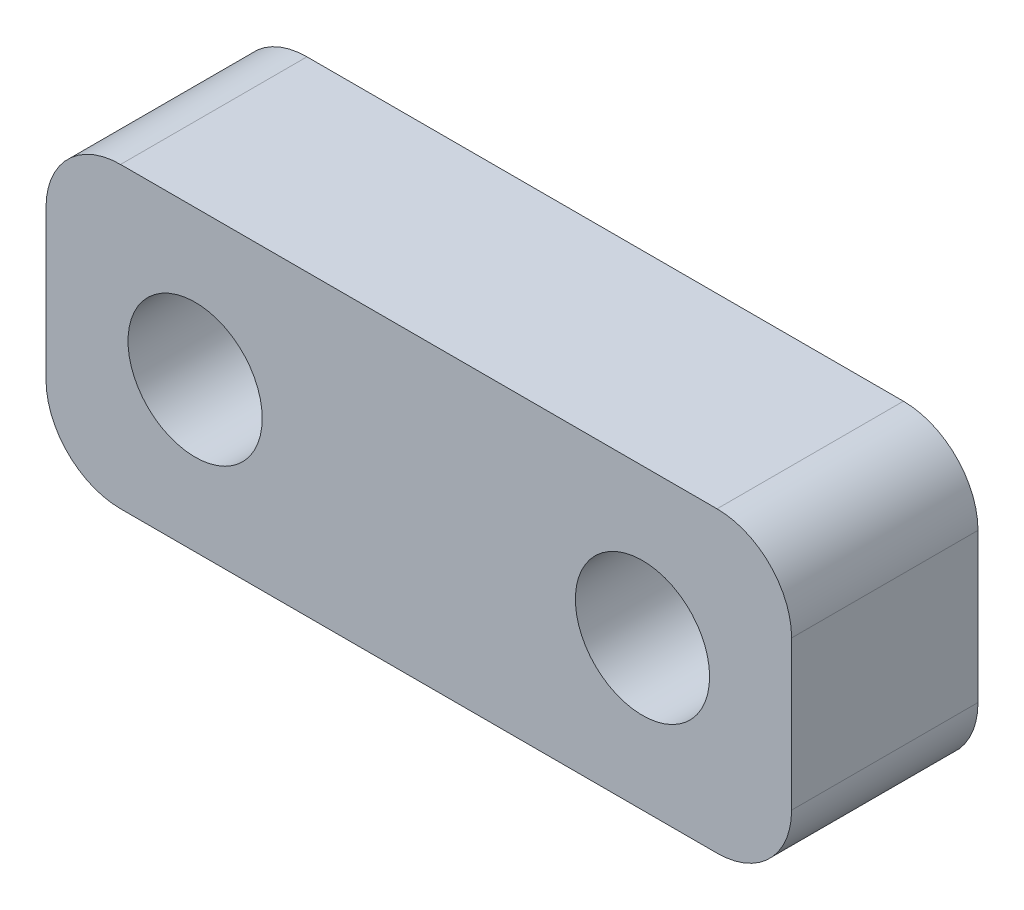
ISO-10303-21;
HEADER;
FILE_DESCRIPTION(('STEP AP214'),'2;1');
FILE_NAME('part.step','',(''),(''),'','','');
FILE_SCHEMA(('AUTOMOTIVE_DESIGN { 1 0 10303 214 1 1 1 1 }'));
ENDSEC;
DATA;
#1=APPLICATION_CONTEXT('core data for automotive mechanical design processes');
#2=APPLICATION_PROTOCOL_DEFINITION('international standard','automotive_design',2000,#1);
#3=PRODUCT_CONTEXT('',#1,'mechanical');
#4=PRODUCT('Part','Part','',(#3));
#5=PRODUCT_RELATED_PRODUCT_CATEGORY('part','',(#4));
#6=PRODUCT_DEFINITION_FORMATION('','',#4);
#7=PRODUCT_DEFINITION_CONTEXT('part definition',#1,'design');
#8=PRODUCT_DEFINITION('design','',#6,#7);
#9=PRODUCT_DEFINITION_SHAPE('','',#8);
#10=(LENGTH_UNIT() NAMED_UNIT(*) SI_UNIT(.MILLI.,.METRE.));
#11=(NAMED_UNIT(*) PLANE_ANGLE_UNIT() SI_UNIT($,.RADIAN.));
#12=(NAMED_UNIT(*) SI_UNIT($,.STERADIAN.) SOLID_ANGLE_UNIT());
#13=UNCERTAINTY_MEASURE_WITH_UNIT(LENGTH_MEASURE(1.E-05),#10,'distance_accuracy_value','');
#14=(GEOMETRIC_REPRESENTATION_CONTEXT(3) GLOBAL_UNCERTAINTY_ASSIGNED_CONTEXT((#13)) GLOBAL_UNIT_ASSIGNED_CONTEXT((#10,
#11,#12)) REPRESENTATION_CONTEXT('',''));
#15=CARTESIAN_POINT('',(0.,0.,0.));
#16=DIRECTION('',(0.,0.,1.));
#17=DIRECTION('',(1.,0.,0.));
#18=AXIS2_PLACEMENT_3D('',#15,#16,#17);
#19=CARTESIAN_POINT('',(0.,0.,5.));
#20=DIRECTION('',(1.,0.,0.));
#21=DIRECTION('',(0.,1.,0.));
#22=AXIS2_PLACEMENT_3D('',#19,#20,#21);
#23=PLANE('',#22);
#24=DIRECTION('',(0.,-1.,0.));
#25=VECTOR('',#24,1.);
#26=CARTESIAN_POINT('',(0.,0.,0.));
#27=LINE('',#26,#25);
#28=CARTESIAN_POINT('',(0.,6.,0.));
#29=VERTEX_POINT('',#28);
#30=CARTESIAN_POINT('',(0.,2.,0.));
#31=VERTEX_POINT('',#30);
#32=EDGE_CURVE('E126',#29,#31,#27,.T.);
#33=ORIENTED_EDGE('',*,*,#32,.T.);
#34=DIRECTION('',(0.,0.,-1.));
#35=VECTOR('',#34,1.);
#36=CARTESIAN_POINT('',(0.,2.,5.));
#37=LINE('',#36,#35);
#38=CARTESIAN_POINT('',(0.,2.,5.));
#39=VERTEX_POINT('',#38);
#40=EDGE_CURVE('E104',#31,#39,#37,.F.);
#41=ORIENTED_EDGE('',*,*,#40,.T.);
#42=DIRECTION('',(0.,-1.,0.));
#43=VECTOR('',#42,1.);
#44=CARTESIAN_POINT('',(0.,0.,5.));
#45=LINE('',#44,#43);
#46=CARTESIAN_POINT('',(0.,6.,5.));
#47=VERTEX_POINT('',#46);
#48=EDGE_CURVE('E136',#47,#39,#45,.T.);
#49=ORIENTED_EDGE('',*,*,#48,.F.);
#50=DIRECTION('',(0.,0.,-1.));
#51=VECTOR('',#50,1.);
#52=CARTESIAN_POINT('',(0.,6.,5.));
#53=LINE('',#52,#51);
#54=EDGE_CURVE('E109',#47,#29,#53,.T.);
#55=ORIENTED_EDGE('',*,*,#54,.T.);
#56=EDGE_LOOP('',(#33,#41,#49,#55));
#57=FACE_BOUND('',#56,.T.);
#58=ADVANCED_FACE('F33',(#57),#23,.F.);
#59=CARTESIAN_POINT('',(0.,0.,5.));
#60=DIRECTION('',(0.,1.,0.));
#61=DIRECTION('',(0.,0.,1.));
#62=AXIS2_PLACEMENT_3D('',#59,#60,#61);
#63=PLANE('',#62);
#64=DIRECTION('',(1.,0.,0.));
#65=VECTOR('',#64,1.);
#66=CARTESIAN_POINT('',(0.,0.,5.));
#67=LINE('',#66,#65);
#68=CARTESIAN_POINT('',(2.,0.,5.));
#69=VERTEX_POINT('',#68);
#70=CARTESIAN_POINT('',(18.,0.,5.));
#71=VERTEX_POINT('',#70);
#72=EDGE_CURVE('E119',#69,#71,#67,.T.);
#73=ORIENTED_EDGE('',*,*,#72,.F.);
#74=DIRECTION('',(0.,0.,-1.));
#75=VECTOR('',#74,1.);
#76=CARTESIAN_POINT('',(2.,0.,5.));
#77=LINE('',#76,#75);
#78=CARTESIAN_POINT('',(2.,0.,0.));
#79=VERTEX_POINT('',#78);
#80=EDGE_CURVE('E103',#69,#79,#77,.T.);
#81=ORIENTED_EDGE('',*,*,#80,.T.);
#82=DIRECTION('',(1.,0.,0.));
#83=VECTOR('',#82,1.);
#84=CARTESIAN_POINT('',(0.,0.,0.));
#85=LINE('',#84,#83);
#86=CARTESIAN_POINT('',(18.,0.,0.));
#87=VERTEX_POINT('',#86);
#88=EDGE_CURVE('E116',#79,#87,#85,.T.);
#89=ORIENTED_EDGE('',*,*,#88,.T.);
#90=DIRECTION('',(0.,0.,-1.));
#91=VECTOR('',#90,1.);
#92=CARTESIAN_POINT('',(18.,0.,5.));
#93=LINE('',#92,#91);
#94=EDGE_CURVE('E121',#87,#71,#93,.F.);
#95=ORIENTED_EDGE('',*,*,#94,.T.);
#96=EDGE_LOOP('',(#73,#81,#89,#95));
#97=FACE_BOUND('',#96,.T.);
#98=ADVANCED_FACE('F115',(#97),#63,.F.);
#99=CARTESIAN_POINT('',(20.,0.,5.));
#100=DIRECTION('',(-1.,0.,0.));
#101=DIRECTION('',(0.,-1.,0.));
#102=AXIS2_PLACEMENT_3D('',#99,#100,#101);
#103=PLANE('',#102);
#104=DIRECTION('',(0.,1.,0.));
#105=VECTOR('',#104,1.);
#106=CARTESIAN_POINT('',(20.,0.,5.));
#107=LINE('',#106,#105);
#108=CARTESIAN_POINT('',(20.,2.,5.));
#109=VERTEX_POINT('',#108);
#110=CARTESIAN_POINT('',(20.,6.,5.));
#111=VERTEX_POINT('',#110);
#112=EDGE_CURVE('E162',#109,#111,#107,.T.);
#113=ORIENTED_EDGE('',*,*,#112,.F.);
#114=DIRECTION('',(0.,0.,-1.));
#115=VECTOR('',#114,1.);
#116=CARTESIAN_POINT('',(20.,2.,5.));
#117=LINE('',#116,#115);
#118=CARTESIAN_POINT('',(20.,2.,0.));
#119=VERTEX_POINT('',#118);
#120=EDGE_CURVE('E155',#109,#119,#117,.T.);
#121=ORIENTED_EDGE('',*,*,#120,.T.);
#122=DIRECTION('',(0.,1.,0.));
#123=VECTOR('',#122,1.);
#124=CARTESIAN_POINT('',(20.,0.,0.));
#125=LINE('',#124,#123);
#126=CARTESIAN_POINT('',(20.,6.,0.));
#127=VERTEX_POINT('',#126);
#128=EDGE_CURVE('E125',#119,#127,#125,.T.);
#129=ORIENTED_EDGE('',*,*,#128,.T.);
#130=DIRECTION('',(0.,0.,-1.));
#131=VECTOR('',#130,1.);
#132=CARTESIAN_POINT('',(20.,6.,5.));
#133=LINE('',#132,#131);
#134=EDGE_CURVE('E153',#127,#111,#133,.F.);
#135=ORIENTED_EDGE('',*,*,#134,.T.);
#136=EDGE_LOOP('',(#113,#121,#129,#135));
#137=FACE_BOUND('',#136,.T.);
#138=ADVANCED_FACE('F160',(#137),#103,.F.);
#139=CARTESIAN_POINT('',(0.,8.,5.));
#140=DIRECTION('',(0.,-1.,0.));
#141=DIRECTION('',(0.,0.,-1.));
#142=AXIS2_PLACEMENT_3D('',#139,#140,#141);
#143=PLANE('',#142);
#144=DIRECTION('',(-1.,0.,0.));
#145=VECTOR('',#144,1.);
#146=CARTESIAN_POINT('',(0.,8.,5.));
#147=LINE('',#146,#145);
#148=CARTESIAN_POINT('',(18.,8.,5.));
#149=VERTEX_POINT('',#148);
#150=CARTESIAN_POINT('',(2.,8.,5.));
#151=VERTEX_POINT('',#150);
#152=EDGE_CURVE('E137',#149,#151,#147,.T.);
#153=ORIENTED_EDGE('',*,*,#152,.F.);
#154=DIRECTION('',(0.,0.,-1.));
#155=VECTOR('',#154,1.);
#156=CARTESIAN_POINT('',(18.,8.,5.));
#157=LINE('',#156,#155);
#158=CARTESIAN_POINT('',(18.,8.,0.));
#159=VERTEX_POINT('',#158);
#160=EDGE_CURVE('E11',#149,#159,#157,.T.);
#161=ORIENTED_EDGE('',*,*,#160,.T.);
#162=DIRECTION('',(-1.,0.,0.));
#163=VECTOR('',#162,1.);
#164=CARTESIAN_POINT('',(0.,8.,0.));
#165=LINE('',#164,#163);
#166=CARTESIAN_POINT('',(2.,8.,0.));
#167=VERTEX_POINT('',#166);
#168=EDGE_CURVE('E129',#159,#167,#165,.T.);
#169=ORIENTED_EDGE('',*,*,#168,.T.);
#170=DIRECTION('',(0.,0.,-1.));
#171=VECTOR('',#170,1.);
#172=CARTESIAN_POINT('',(2.,8.,5.));
#173=LINE('',#172,#171);
#174=EDGE_CURVE('E41',#167,#151,#173,.F.);
#175=ORIENTED_EDGE('',*,*,#174,.T.);
#176=EDGE_LOOP('',(#153,#161,#169,#175));
#177=FACE_BOUND('',#176,.T.);
#178=ADVANCED_FACE('F169',(#177),#143,.F.);
#179=CARTESIAN_POINT('',(0.,0.,5.));
#180=DIRECTION('',(0.,0.,-1.));
#181=DIRECTION('',(-1.,0.,0.));
#182=AXIS2_PLACEMENT_3D('',#179,#180,#181);
#183=PLANE('',#182);
#184=CARTESIAN_POINT('',(4.,4.,5.));
#185=DIRECTION('',(0.,0.,1.));
#186=DIRECTION('',(1.,0.,0.));
#187=AXIS2_PLACEMENT_3D('',#184,#185,#186);
#188=CIRCLE('',#187,1.8);
#189=CARTESIAN_POINT('',(5.8,4.,5.));
#190=VERTEX_POINT('',#189);
#191=EDGE_CURVE('E184',#190,#190,#188,.T.);
#192=ORIENTED_EDGE('',*,*,#191,.F.);
#193=EDGE_LOOP('',(#192));
#194=FACE_BOUND('',#193,.T.);
#195=CARTESIAN_POINT('',(16.,4.,5.));
#196=DIRECTION('',(0.,0.,1.));
#197=DIRECTION('',(1.,0.,0.));
#198=AXIS2_PLACEMENT_3D('',#195,#196,#197);
#199=CIRCLE('',#198,1.8);
#200=CARTESIAN_POINT('',(17.8,4.,5.));
#201=VERTEX_POINT('',#200);
#202=EDGE_CURVE('E178',#201,#201,#199,.T.);
#203=ORIENTED_EDGE('',*,*,#202,.F.);
#204=EDGE_LOOP('',(#203));
#205=FACE_BOUND('',#204,.T.);
#206=ORIENTED_EDGE('',*,*,#48,.T.);
#207=CARTESIAN_POINT('',(2.,2.,5.));
#208=DIRECTION('',(0.,0.,-1.));
#209=DIRECTION('',(-1.,0.,0.));
#210=AXIS2_PLACEMENT_3D('',#207,#208,#209);
#211=CIRCLE('',#210,2.);
#212=EDGE_CURVE('E151',#39,#69,#211,.F.);
#213=ORIENTED_EDGE('',*,*,#212,.T.);
#214=ORIENTED_EDGE('',*,*,#72,.T.);
#215=CARTESIAN_POINT('',(18.,2.,5.));
#216=DIRECTION('',(0.,0.,-1.));
#217=DIRECTION('',(-1.,0.,0.));
#218=AXIS2_PLACEMENT_3D('',#215,#216,#217);
#219=CIRCLE('',#218,2.);
#220=EDGE_CURVE('E149',#71,#109,#219,.F.);
#221=ORIENTED_EDGE('',*,*,#220,.T.);
#222=ORIENTED_EDGE('',*,*,#112,.T.);
#223=CARTESIAN_POINT('',(18.,6.,5.));
#224=DIRECTION('',(0.,0.,-1.));
#225=DIRECTION('',(-1.,0.,0.));
#226=AXIS2_PLACEMENT_3D('',#223,#224,#225);
#227=CIRCLE('',#226,2.);
#228=EDGE_CURVE('E54',#111,#149,#227,.F.);
#229=ORIENTED_EDGE('',*,*,#228,.T.);
#230=ORIENTED_EDGE('',*,*,#152,.T.);
#231=CARTESIAN_POINT('',(2.,6.,5.));
#232=DIRECTION('',(0.,0.,-1.));
#233=DIRECTION('',(-1.,0.,0.));
#234=AXIS2_PLACEMENT_3D('',#231,#232,#233);
#235=CIRCLE('',#234,2.);
#236=EDGE_CURVE('E146',#151,#47,#235,.F.);
#237=ORIENTED_EDGE('',*,*,#236,.T.);
#238=EDGE_LOOP('',(#206,#213,#214,#221,#222,#229,#230,#237));
#239=FACE_BOUND('',#238,.T.);
#240=ADVANCED_FACE('F190',(#194,#205,#239),#183,.F.);
#241=CARTESIAN_POINT('',(0.,0.,0.));
#242=DIRECTION('',(0.,0.,-1.));
#243=DIRECTION('',(-1.,0.,0.));
#244=AXIS2_PLACEMENT_3D('',#241,#242,#243);
#245=PLANE('',#244);
#246=CARTESIAN_POINT('',(4.,4.,0.));
#247=DIRECTION('',(0.,0.,1.));
#248=DIRECTION('',(1.,0.,0.));
#249=AXIS2_PLACEMENT_3D('',#246,#247,#248);
#250=CIRCLE('',#249,1.8);
#251=CARTESIAN_POINT('',(5.8,4.,0.));
#252=VERTEX_POINT('',#251);
#253=EDGE_CURVE('E181',#252,#252,#250,.T.);
#254=ORIENTED_EDGE('',*,*,#253,.T.);
#255=EDGE_LOOP('',(#254));
#256=FACE_BOUND('',#255,.T.);
#257=CARTESIAN_POINT('',(16.,4.,0.));
#258=DIRECTION('',(0.,0.,1.));
#259=DIRECTION('',(1.,0.,0.));
#260=AXIS2_PLACEMENT_3D('',#257,#258,#259);
#261=CIRCLE('',#260,1.8);
#262=CARTESIAN_POINT('',(17.8,4.,0.));
#263=VERTEX_POINT('',#262);
#264=EDGE_CURVE('E131',#263,#263,#261,.T.);
#265=ORIENTED_EDGE('',*,*,#264,.T.);
#266=EDGE_LOOP('',(#265));
#267=FACE_BOUND('',#266,.T.);
#268=ORIENTED_EDGE('',*,*,#88,.F.);
#269=CARTESIAN_POINT('',(2.,2.,0.));
#270=DIRECTION('',(0.,0.,-1.));
#271=DIRECTION('',(-1.,0.,0.));
#272=AXIS2_PLACEMENT_3D('',#269,#270,#271);
#273=CIRCLE('',#272,2.);
#274=EDGE_CURVE('E99',#79,#31,#273,.T.);
#275=ORIENTED_EDGE('',*,*,#274,.T.);
#276=ORIENTED_EDGE('',*,*,#32,.F.);
#277=CARTESIAN_POINT('',(2.,6.,0.));
#278=DIRECTION('',(0.,0.,-1.));
#279=DIRECTION('',(-1.,0.,0.));
#280=AXIS2_PLACEMENT_3D('',#277,#278,#279);
#281=CIRCLE('',#280,2.);
#282=EDGE_CURVE('E120',#29,#167,#281,.T.);
#283=ORIENTED_EDGE('',*,*,#282,.T.);
#284=ORIENTED_EDGE('',*,*,#168,.F.);
#285=CARTESIAN_POINT('',(18.,6.,0.));
#286=DIRECTION('',(0.,0.,-1.));
#287=DIRECTION('',(-1.,0.,0.));
#288=AXIS2_PLACEMENT_3D('',#285,#286,#287);
#289=CIRCLE('',#288,2.);
#290=EDGE_CURVE('E140',#159,#127,#289,.T.);
#291=ORIENTED_EDGE('',*,*,#290,.T.);
#292=ORIENTED_EDGE('',*,*,#128,.F.);
#293=CARTESIAN_POINT('',(18.,2.,0.));
#294=DIRECTION('',(0.,0.,-1.));
#295=DIRECTION('',(-1.,0.,0.));
#296=AXIS2_PLACEMENT_3D('',#293,#294,#295);
#297=CIRCLE('',#296,2.);
#298=EDGE_CURVE('E110',#119,#87,#297,.T.);
#299=ORIENTED_EDGE('',*,*,#298,.T.);
#300=EDGE_LOOP('',(#268,#275,#276,#283,#284,#291,#292,#299));
#301=FACE_BOUND('',#300,.T.);
#302=ADVANCED_FACE('F123',(#256,#267,#301),#245,.T.);
#303=CARTESIAN_POINT('',(16.,4.,5.));
#304=DIRECTION('',(0.,0.,1.));
#305=DIRECTION('',(1.,0.,0.));
#306=AXIS2_PLACEMENT_3D('',#303,#304,#305);
#307=CYLINDRICAL_SURFACE('',#306,1.8);
#308=ORIENTED_EDGE('',*,*,#264,.F.);
#309=EDGE_LOOP('',(#308));
#310=FACE_BOUND('',#309,.T.);
#311=ORIENTED_EDGE('',*,*,#202,.T.);
#312=EDGE_LOOP('',(#311));
#313=FACE_BOUND('',#312,.T.);
#314=ADVANCED_FACE('F244',(#310,#313),#307,.F.);
#315=CARTESIAN_POINT('',(4.,4.,5.));
#316=DIRECTION('',(0.,0.,1.));
#317=DIRECTION('',(1.,0.,0.));
#318=AXIS2_PLACEMENT_3D('',#315,#316,#317);
#319=CYLINDRICAL_SURFACE('',#318,1.8);
#320=ORIENTED_EDGE('',*,*,#253,.F.);
#321=EDGE_LOOP('',(#320));
#322=FACE_BOUND('',#321,.T.);
#323=ORIENTED_EDGE('',*,*,#191,.T.);
#324=EDGE_LOOP('',(#323));
#325=FACE_BOUND('',#324,.T.);
#326=ADVANCED_FACE('F188',(#322,#325),#319,.F.);
#327=CARTESIAN_POINT('',(2.,2.,5.));
#328=DIRECTION('',(0.,0.,-1.));
#329=DIRECTION('',(-1.,0.,0.));
#330=AXIS2_PLACEMENT_3D('',#327,#328,#329);
#331=CYLINDRICAL_SURFACE('',#330,2.);
#332=ORIENTED_EDGE('',*,*,#212,.F.);
#333=ORIENTED_EDGE('',*,*,#40,.F.);
#334=ORIENTED_EDGE('',*,*,#274,.F.);
#335=ORIENTED_EDGE('',*,*,#80,.F.);
#336=EDGE_LOOP('',(#332,#333,#334,#335));
#337=FACE_BOUND('',#336,.T.);
#338=ADVANCED_FACE('F102',(#337),#331,.T.);
#339=CARTESIAN_POINT('',(18.,2.,5.));
#340=DIRECTION('',(0.,0.,-1.));
#341=DIRECTION('',(-1.,0.,0.));
#342=AXIS2_PLACEMENT_3D('',#339,#340,#341);
#343=CYLINDRICAL_SURFACE('',#342,2.);
#344=ORIENTED_EDGE('',*,*,#220,.F.);
#345=ORIENTED_EDGE('',*,*,#94,.F.);
#346=ORIENTED_EDGE('',*,*,#298,.F.);
#347=ORIENTED_EDGE('',*,*,#120,.F.);
#348=EDGE_LOOP('',(#344,#345,#346,#347));
#349=FACE_BOUND('',#348,.T.);
#350=ADVANCED_FACE('F203',(#349),#343,.T.);
#351=CARTESIAN_POINT('',(18.,6.,5.));
#352=DIRECTION('',(0.,0.,-1.));
#353=DIRECTION('',(-1.,0.,0.));
#354=AXIS2_PLACEMENT_3D('',#351,#352,#353);
#355=CYLINDRICAL_SURFACE('',#354,2.);
#356=ORIENTED_EDGE('',*,*,#228,.F.);
#357=ORIENTED_EDGE('',*,*,#134,.F.);
#358=ORIENTED_EDGE('',*,*,#290,.F.);
#359=ORIENTED_EDGE('',*,*,#160,.F.);
#360=EDGE_LOOP('',(#356,#357,#358,#359));
#361=FACE_BOUND('',#360,.T.);
#362=ADVANCED_FACE('F168',(#361),#355,.T.);
#363=CARTESIAN_POINT('',(2.,6.,5.));
#364=DIRECTION('',(0.,0.,-1.));
#365=DIRECTION('',(-1.,0.,0.));
#366=AXIS2_PLACEMENT_3D('',#363,#364,#365);
#367=CYLINDRICAL_SURFACE('',#366,2.);
#368=ORIENTED_EDGE('',*,*,#236,.F.);
#369=ORIENTED_EDGE('',*,*,#174,.F.);
#370=ORIENTED_EDGE('',*,*,#282,.F.);
#371=ORIENTED_EDGE('',*,*,#54,.F.);
#372=EDGE_LOOP('',(#368,#369,#370,#371));
#373=FACE_BOUND('',#372,.T.);
#374=ADVANCED_FACE('F35',(#373),#367,.T.);
#375=CLOSED_SHELL('',(#58,#98,#138,#178,#240,#302,#314,#326,#338,#350,#362,#374));
#376=MANIFOLD_SOLID_BREP('B2',#375);
#377=ADVANCED_BREP_SHAPE_REPRESENTATION('',(#18,#376),#14);
#378=SHAPE_DEFINITION_REPRESENTATION(#9,#377);
ENDSEC;
END-ISO-10303-21;
